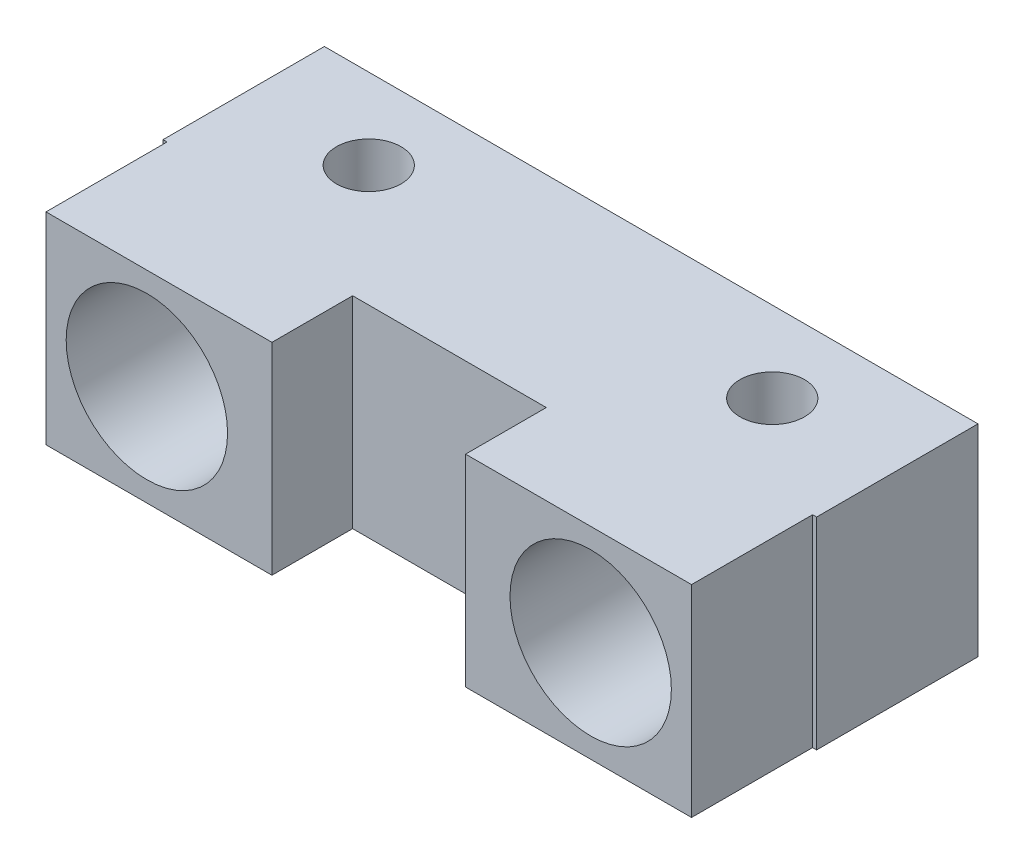
ISO-10303-21;
HEADER;
FILE_DESCRIPTION(('STEP AP214'),'2;1');
FILE_NAME('part.step','',(''),(''),'','','');
FILE_SCHEMA(('AUTOMOTIVE_DESIGN { 1 0 10303 214 1 1 1 1 }'));
ENDSEC;
DATA;
#1=APPLICATION_CONTEXT('core data for automotive mechanical design processes');
#2=APPLICATION_PROTOCOL_DEFINITION('international standard','automotive_design',2000,#1);
#3=PRODUCT_CONTEXT('',#1,'mechanical');
#4=PRODUCT('Part','Part','',(#3));
#5=PRODUCT_RELATED_PRODUCT_CATEGORY('part','',(#4));
#6=PRODUCT_DEFINITION_FORMATION('','',#4);
#7=PRODUCT_DEFINITION_CONTEXT('part definition',#1,'design');
#8=PRODUCT_DEFINITION('design','',#6,#7);
#9=PRODUCT_DEFINITION_SHAPE('','',#8);
#10=(LENGTH_UNIT() NAMED_UNIT(*) SI_UNIT(.MILLI.,.METRE.));
#11=(NAMED_UNIT(*) PLANE_ANGLE_UNIT() SI_UNIT($,.RADIAN.));
#12=(NAMED_UNIT(*) SI_UNIT($,.STERADIAN.) SOLID_ANGLE_UNIT());
#13=UNCERTAINTY_MEASURE_WITH_UNIT(LENGTH_MEASURE(1.E-05),#10,'distance_accuracy_value','');
#14=(GEOMETRIC_REPRESENTATION_CONTEXT(3) GLOBAL_UNCERTAINTY_ASSIGNED_CONTEXT((#13)) GLOBAL_UNIT_ASSIGNED_CONTEXT((#10,
#11,#12)) REPRESENTATION_CONTEXT('',''));
#15=CARTESIAN_POINT('',(0.,0.,0.));
#16=DIRECTION('',(0.,0.,1.));
#17=DIRECTION('',(1.,0.,0.));
#18=AXIS2_PLACEMENT_3D('',#15,#16,#17);
#19=CARTESIAN_POINT('',(-40.,12.5,25.));
#20=DIRECTION('',(0.,0.,-1.));
#21=DIRECTION('',(-1.,0.,0.));
#22=AXIS2_PLACEMENT_3D('',#19,#20,#21);
#23=PLANE('',#22);
#24=CARTESIAN_POINT('',(27.5,0.,25.));
#25=DIRECTION('',(0.,0.,1.));
#26=DIRECTION('',(-1.,0.,0.));
#27=AXIS2_PLACEMENT_3D('',#24,#25,#26);
#28=CIRCLE('',#27,10.);
#29=CARTESIAN_POINT('',(17.5,0.,25.));
#30=VERTEX_POINT('',#29);
#31=EDGE_CURVE('E252',#30,#30,#28,.T.);
#32=ORIENTED_EDGE('',*,*,#31,.F.);
#33=EDGE_LOOP('',(#32));
#34=FACE_BOUND('',#33,.T.);
#35=DIRECTION('',(1.,0.,0.));
#36=VECTOR('',#35,1.);
#37=CARTESIAN_POINT('',(-40.,12.5,25.));
#38=LINE('',#37,#36);
#39=CARTESIAN_POINT('',(12.,12.5,25.));
#40=VERTEX_POINT('',#39);
#41=CARTESIAN_POINT('',(40.,12.5,25.));
#42=VERTEX_POINT('',#41);
#43=EDGE_CURVE('E122',#40,#42,#38,.T.);
#44=ORIENTED_EDGE('',*,*,#43,.F.);
#45=DIRECTION('',(0.,-1.,0.));
#46=VECTOR('',#45,1.);
#47=CARTESIAN_POINT('',(12.,12.5,25.));
#48=LINE('',#47,#46);
#49=CARTESIAN_POINT('',(12.,-12.5,25.));
#50=VERTEX_POINT('',#49);
#51=EDGE_CURVE('E48',#40,#50,#48,.T.);
#52=ORIENTED_EDGE('',*,*,#51,.T.);
#53=DIRECTION('',(1.,0.,0.));
#54=VECTOR('',#53,1.);
#55=CARTESIAN_POINT('',(-40.,-12.5,25.));
#56=LINE('',#55,#54);
#57=CARTESIAN_POINT('',(40.,-12.5,25.));
#58=VERTEX_POINT('',#57);
#59=EDGE_CURVE('E142',#50,#58,#56,.T.);
#60=ORIENTED_EDGE('',*,*,#59,.T.);
#61=DIRECTION('',(0.,-1.,0.));
#62=VECTOR('',#61,1.);
#63=CARTESIAN_POINT('',(40.,12.5,25.));
#64=LINE('',#63,#62);
#65=EDGE_CURVE('E140',#42,#58,#64,.T.);
#66=ORIENTED_EDGE('',*,*,#65,.F.);
#67=EDGE_LOOP('',(#44,#52,#60,#66));
#68=FACE_BOUND('',#67,.T.);
#69=ADVANCED_FACE('F39',(#34,#68),#23,.F.);
#70=CARTESIAN_POINT('',(0.,12.5,0.));
#71=DIRECTION('',(0.,-1.,0.));
#72=DIRECTION('',(0.,0.,-1.));
#73=AXIS2_PLACEMENT_3D('',#70,#71,#72);
#74=PLANE('',#73);
#75=DIRECTION('',(1.,0.,0.));
#76=VECTOR('',#75,1.);
#77=CARTESIAN_POINT('',(0.,12.5,15.));
#78=LINE('',#77,#76);
#79=CARTESIAN_POINT('',(-12.,12.5,15.));
#80=VERTEX_POINT('',#79);
#81=CARTESIAN_POINT('',(12.,12.5,15.));
#82=VERTEX_POINT('',#81);
#83=EDGE_CURVE('E256',#80,#82,#78,.T.);
#84=ORIENTED_EDGE('',*,*,#83,.T.);
#85=DIRECTION('',(0.,0.,1.));
#86=VECTOR('',#85,1.);
#87=CARTESIAN_POINT('',(12.,12.5,0.));
#88=LINE('',#87,#86);
#89=EDGE_CURVE('E132',#82,#40,#88,.T.);
#90=ORIENTED_EDGE('',*,*,#89,.T.);
#91=ORIENTED_EDGE('',*,*,#43,.T.);
#92=DIRECTION('',(0.,0.,-1.));
#93=VECTOR('',#92,1.);
#94=CARTESIAN_POINT('',(40.,12.5,9.99999999999999));
#95=LINE('',#94,#93);
#96=CARTESIAN_POINT('',(40.,12.5,9.99999999999999));
#97=VERTEX_POINT('',#96);
#98=EDGE_CURVE('E128',#42,#97,#95,.T.);
#99=ORIENTED_EDGE('',*,*,#98,.T.);
#100=DIRECTION('',(1.,0.,0.));
#101=VECTOR('',#100,1.);
#102=CARTESIAN_POINT('',(40.,12.5,9.99999999999999));
#103=LINE('',#102,#101);
#104=CARTESIAN_POINT('',(40.5,12.5,10.));
#105=VERTEX_POINT('',#104);
#106=EDGE_CURVE('E64',#97,#105,#103,.T.);
#107=ORIENTED_EDGE('',*,*,#106,.T.);
#108=DIRECTION('',(0.,0.,-1.));
#109=VECTOR('',#108,1.);
#110=CARTESIAN_POINT('',(40.5,12.5,10.));
#111=LINE('',#110,#109);
#112=CARTESIAN_POINT('',(40.5,12.5,-10.));
#113=VERTEX_POINT('',#112);
#114=EDGE_CURVE('E185',#105,#113,#111,.T.);
#115=ORIENTED_EDGE('',*,*,#114,.T.);
#116=DIRECTION('',(-1.,0.,0.));
#117=VECTOR('',#116,1.);
#118=CARTESIAN_POINT('',(-40.5,12.5,-10.));
#119=LINE('',#118,#117);
#120=CARTESIAN_POINT('',(-40.5,12.5,-10.));
#121=VERTEX_POINT('',#120);
#122=EDGE_CURVE('E106',#113,#121,#119,.T.);
#123=ORIENTED_EDGE('',*,*,#122,.T.);
#124=DIRECTION('',(0.,0.,1.));
#125=VECTOR('',#124,1.);
#126=CARTESIAN_POINT('',(-40.5,12.5,10.));
#127=LINE('',#126,#125);
#128=CARTESIAN_POINT('',(-40.5,12.5,10.));
#129=VERTEX_POINT('',#128);
#130=EDGE_CURVE('E285',#121,#129,#127,.T.);
#131=ORIENTED_EDGE('',*,*,#130,.T.);
#132=DIRECTION('',(1.,0.,0.));
#133=VECTOR('',#132,1.);
#134=CARTESIAN_POINT('',(-40.5,12.5,10.));
#135=LINE('',#134,#133);
#136=CARTESIAN_POINT('',(-40.,12.5,10.));
#137=VERTEX_POINT('',#136);
#138=EDGE_CURVE('E288',#129,#137,#135,.T.);
#139=ORIENTED_EDGE('',*,*,#138,.T.);
#140=DIRECTION('',(0.,0.,1.));
#141=VECTOR('',#140,1.);
#142=CARTESIAN_POINT('',(-40.,12.5,10.));
#143=LINE('',#142,#141);
#144=CARTESIAN_POINT('',(-40.,12.5,25.));
#145=VERTEX_POINT('',#144);
#146=EDGE_CURVE('E137',#137,#145,#143,.T.);
#147=ORIENTED_EDGE('',*,*,#146,.T.);
#148=CARTESIAN_POINT('',(-12.,12.5,25.));
#149=VERTEX_POINT('',#148);
#150=EDGE_CURVE('E136',#145,#149,#38,.T.);
#151=ORIENTED_EDGE('',*,*,#150,.T.);
#152=DIRECTION('',(0.,0.,-1.));
#153=VECTOR('',#152,1.);
#154=CARTESIAN_POINT('',(-12.,12.5,0.));
#155=LINE('',#154,#153);
#156=EDGE_CURVE('E55',#149,#80,#155,.T.);
#157=ORIENTED_EDGE('',*,*,#156,.T.);
#158=EDGE_LOOP('',(#84,#90,#91,#99,#107,#115,#123,#131,#139,#147,#151,#157));
#159=FACE_BOUND('',#158,.T.);
#160=CARTESIAN_POINT('',(-25.,12.5,0.));
#161=DIRECTION('',(0.,1.,0.));
#162=DIRECTION('',(0.,0.,1.));
#163=AXIS2_PLACEMENT_3D('',#160,#161,#162);
#164=CIRCLE('',#163,4.);
#165=CARTESIAN_POINT('',(-25.,12.5,4.));
#166=VERTEX_POINT('',#165);
#167=EDGE_CURVE('E164',#166,#166,#164,.T.);
#168=ORIENTED_EDGE('',*,*,#167,.F.);
#169=EDGE_LOOP('',(#168));
#170=FACE_BOUND('',#169,.T.);
#171=CARTESIAN_POINT('',(25.,12.5,0.));
#172=DIRECTION('',(0.,1.,0.));
#173=DIRECTION('',(0.,0.,-1.));
#174=AXIS2_PLACEMENT_3D('',#171,#172,#173);
#175=CIRCLE('',#174,4.);
#176=CARTESIAN_POINT('',(25.,12.5,-4.00000000000001));
#177=VERTEX_POINT('',#176);
#178=EDGE_CURVE('E232',#177,#177,#175,.T.);
#179=ORIENTED_EDGE('',*,*,#178,.F.);
#180=EDGE_LOOP('',(#179));
#181=FACE_BOUND('',#180,.T.);
#182=ADVANCED_FACE('F125',(#159,#170,#181),#74,.F.);
#183=CARTESIAN_POINT('',(0.,-12.5,0.));
#184=DIRECTION('',(0.,-1.,0.));
#185=DIRECTION('',(0.,0.,-1.));
#186=AXIS2_PLACEMENT_3D('',#183,#184,#185);
#187=PLANE('',#186);
#188=DIRECTION('',(0.,0.,1.));
#189=VECTOR('',#188,1.);
#190=CARTESIAN_POINT('',(12.,-12.5,0.));
#191=LINE('',#190,#189);
#192=CARTESIAN_POINT('',(12.,-12.5,15.));
#193=VERTEX_POINT('',#192);
#194=EDGE_CURVE('E223',#193,#50,#191,.T.);
#195=ORIENTED_EDGE('',*,*,#194,.F.);
#196=DIRECTION('',(1.,0.,0.));
#197=VECTOR('',#196,1.);
#198=CARTESIAN_POINT('',(0.,-12.5,15.));
#199=LINE('',#198,#197);
#200=CARTESIAN_POINT('',(-12.,-12.5,15.));
#201=VERTEX_POINT('',#200);
#202=EDGE_CURVE('E11',#201,#193,#199,.T.);
#203=ORIENTED_EDGE('',*,*,#202,.F.);
#204=DIRECTION('',(0.,0.,-1.));
#205=VECTOR('',#204,1.);
#206=CARTESIAN_POINT('',(-12.,-12.5,0.));
#207=LINE('',#206,#205);
#208=CARTESIAN_POINT('',(-12.,-12.5,25.));
#209=VERTEX_POINT('',#208);
#210=EDGE_CURVE('E265',#209,#201,#207,.T.);
#211=ORIENTED_EDGE('',*,*,#210,.F.);
#212=CARTESIAN_POINT('',(-40.,-12.5,25.));
#213=VERTEX_POINT('',#212);
#214=EDGE_CURVE('E176',#213,#209,#56,.T.);
#215=ORIENTED_EDGE('',*,*,#214,.F.);
#216=DIRECTION('',(0.,0.,1.));
#217=VECTOR('',#216,1.);
#218=CARTESIAN_POINT('',(-40.,-12.5,10.));
#219=LINE('',#218,#217);
#220=CARTESIAN_POINT('',(-40.,-12.5,10.));
#221=VERTEX_POINT('',#220);
#222=EDGE_CURVE('E173',#221,#213,#219,.T.);
#223=ORIENTED_EDGE('',*,*,#222,.F.);
#224=DIRECTION('',(1.,0.,0.));
#225=VECTOR('',#224,1.);
#226=CARTESIAN_POINT('',(-40.5,-12.5,10.));
#227=LINE('',#226,#225);
#228=CARTESIAN_POINT('',(-40.5,-12.5,10.));
#229=VERTEX_POINT('',#228);
#230=EDGE_CURVE('E170',#229,#221,#227,.T.);
#231=ORIENTED_EDGE('',*,*,#230,.F.);
#232=DIRECTION('',(0.,0.,1.));
#233=VECTOR('',#232,1.);
#234=CARTESIAN_POINT('',(-40.5,-12.5,10.));
#235=LINE('',#234,#233);
#236=CARTESIAN_POINT('',(-40.5,-12.5,-10.));
#237=VERTEX_POINT('',#236);
#238=EDGE_CURVE('E167',#237,#229,#235,.T.);
#239=ORIENTED_EDGE('',*,*,#238,.F.);
#240=DIRECTION('',(-1.,0.,0.));
#241=VECTOR('',#240,1.);
#242=CARTESIAN_POINT('',(-40.5,-12.5,-10.));
#243=LINE('',#242,#241);
#244=CARTESIAN_POINT('',(40.5,-12.5,-10.));
#245=VERTEX_POINT('',#244);
#246=EDGE_CURVE('E163',#245,#237,#243,.T.);
#247=ORIENTED_EDGE('',*,*,#246,.F.);
#248=DIRECTION('',(0.,0.,-1.));
#249=VECTOR('',#248,1.);
#250=CARTESIAN_POINT('',(40.5,-12.5,10.));
#251=LINE('',#250,#249);
#252=CARTESIAN_POINT('',(40.5,-12.5,10.));
#253=VERTEX_POINT('',#252);
#254=EDGE_CURVE('E159',#253,#245,#251,.T.);
#255=ORIENTED_EDGE('',*,*,#254,.F.);
#256=DIRECTION('',(1.,0.,0.));
#257=VECTOR('',#256,1.);
#258=CARTESIAN_POINT('',(40.,-12.5,9.99999999999999));
#259=LINE('',#258,#257);
#260=CARTESIAN_POINT('',(40.,-12.5,9.99999999999999));
#261=VERTEX_POINT('',#260);
#262=EDGE_CURVE('E97',#261,#253,#259,.T.);
#263=ORIENTED_EDGE('',*,*,#262,.F.);
#264=DIRECTION('',(0.,0.,-1.));
#265=VECTOR('',#264,1.);
#266=CARTESIAN_POINT('',(40.,-12.5,9.99999999999999));
#267=LINE('',#266,#265);
#268=EDGE_CURVE('E180',#58,#261,#267,.T.);
#269=ORIENTED_EDGE('',*,*,#268,.F.);
#270=ORIENTED_EDGE('',*,*,#59,.F.);
#271=EDGE_LOOP('',(#195,#203,#211,#215,#223,#231,#239,#247,#255,#263,#269,#270));
#272=FACE_BOUND('',#271,.T.);
#273=CARTESIAN_POINT('',(-25.,-12.5,0.));
#274=DIRECTION('',(0.,1.,0.));
#275=DIRECTION('',(0.,0.,1.));
#276=AXIS2_PLACEMENT_3D('',#273,#274,#275);
#277=CIRCLE('',#276,4.);
#278=CARTESIAN_POINT('',(-25.,-12.5,4.));
#279=VERTEX_POINT('',#278);
#280=EDGE_CURVE('E228',#279,#279,#277,.T.);
#281=ORIENTED_EDGE('',*,*,#280,.T.);
#282=EDGE_LOOP('',(#281));
#283=FACE_BOUND('',#282,.T.);
#284=CARTESIAN_POINT('',(25.,-12.5,0.));
#285=DIRECTION('',(0.,1.,0.));
#286=DIRECTION('',(0.,0.,-1.));
#287=AXIS2_PLACEMENT_3D('',#284,#285,#286);
#288=CIRCLE('',#287,4.);
#289=CARTESIAN_POINT('',(25.,-12.5,-4.00000000000001));
#290=VERTEX_POINT('',#289);
#291=EDGE_CURVE('E236',#290,#290,#288,.T.);
#292=ORIENTED_EDGE('',*,*,#291,.T.);
#293=EDGE_LOOP('',(#292));
#294=FACE_BOUND('',#293,.T.);
#295=ADVANCED_FACE('F219',(#272,#283,#294),#187,.T.);
#296=CARTESIAN_POINT('',(40.5,12.5,10.));
#297=DIRECTION('',(-1.,0.,0.));
#298=DIRECTION('',(0.,0.,1.));
#299=AXIS2_PLACEMENT_3D('',#296,#297,#298);
#300=PLANE('',#299);
#301=ORIENTED_EDGE('',*,*,#254,.T.);
#302=DIRECTION('',(0.,-1.,0.));
#303=VECTOR('',#302,1.);
#304=CARTESIAN_POINT('',(40.5,12.5,-10.));
#305=LINE('',#304,#303);
#306=EDGE_CURVE('E205',#113,#245,#305,.T.);
#307=ORIENTED_EDGE('',*,*,#306,.F.);
#308=ORIENTED_EDGE('',*,*,#114,.F.);
#309=DIRECTION('',(0.,-1.,0.));
#310=VECTOR('',#309,1.);
#311=CARTESIAN_POINT('',(40.5,12.5,10.));
#312=LINE('',#311,#310);
#313=EDGE_CURVE('E154',#105,#253,#312,.T.);
#314=ORIENTED_EDGE('',*,*,#313,.T.);
#315=EDGE_LOOP('',(#301,#307,#308,#314));
#316=FACE_BOUND('',#315,.T.);
#317=ADVANCED_FACE('F41',(#316),#300,.F.);
#318=CARTESIAN_POINT('',(-40.5,12.5,-10.));
#319=DIRECTION('',(0.,0.,1.));
#320=DIRECTION('',(1.,0.,0.));
#321=AXIS2_PLACEMENT_3D('',#318,#319,#320);
#322=PLANE('',#321);
#323=ORIENTED_EDGE('',*,*,#246,.T.);
#324=DIRECTION('',(0.,-1.,0.));
#325=VECTOR('',#324,1.);
#326=CARTESIAN_POINT('',(-40.5,12.5,-10.));
#327=LINE('',#326,#325);
#328=EDGE_CURVE('E201',#121,#237,#327,.T.);
#329=ORIENTED_EDGE('',*,*,#328,.F.);
#330=ORIENTED_EDGE('',*,*,#122,.F.);
#331=ORIENTED_EDGE('',*,*,#306,.T.);
#332=EDGE_LOOP('',(#323,#329,#330,#331));
#333=FACE_BOUND('',#332,.T.);
#334=ADVANCED_FACE('F474',(#333),#322,.F.);
#335=CARTESIAN_POINT('',(-40.5,12.5,10.));
#336=DIRECTION('',(1.,0.,0.));
#337=DIRECTION('',(0.,0.,-1.));
#338=AXIS2_PLACEMENT_3D('',#335,#336,#337);
#339=PLANE('',#338);
#340=ORIENTED_EDGE('',*,*,#238,.T.);
#341=DIRECTION('',(0.,-1.,0.));
#342=VECTOR('',#341,1.);
#343=CARTESIAN_POINT('',(-40.5,12.5,10.));
#344=LINE('',#343,#342);
#345=EDGE_CURVE('E197',#129,#229,#344,.T.);
#346=ORIENTED_EDGE('',*,*,#345,.F.);
#347=ORIENTED_EDGE('',*,*,#130,.F.);
#348=ORIENTED_EDGE('',*,*,#328,.T.);
#349=EDGE_LOOP('',(#340,#346,#347,#348));
#350=FACE_BOUND('',#349,.T.);
#351=ADVANCED_FACE('F464',(#350),#339,.F.);
#352=CARTESIAN_POINT('',(-40.5,12.5,10.));
#353=DIRECTION('',(0.,0.,-1.));
#354=DIRECTION('',(-1.,0.,0.));
#355=AXIS2_PLACEMENT_3D('',#352,#353,#354);
#356=PLANE('',#355);
#357=ORIENTED_EDGE('',*,*,#230,.T.);
#358=DIRECTION('',(0.,-1.,0.));
#359=VECTOR('',#358,1.);
#360=CARTESIAN_POINT('',(-40.,12.5,10.));
#361=LINE('',#360,#359);
#362=EDGE_CURVE('E193',#137,#221,#361,.T.);
#363=ORIENTED_EDGE('',*,*,#362,.F.);
#364=ORIENTED_EDGE('',*,*,#138,.F.);
#365=ORIENTED_EDGE('',*,*,#345,.T.);
#366=EDGE_LOOP('',(#357,#363,#364,#365));
#367=FACE_BOUND('',#366,.T.);
#368=ADVANCED_FACE('F337',(#367),#356,.F.);
#369=CARTESIAN_POINT('',(-40.,12.5,10.));
#370=DIRECTION('',(1.,0.,0.));
#371=DIRECTION('',(0.,0.,-1.));
#372=AXIS2_PLACEMENT_3D('',#369,#370,#371);
#373=PLANE('',#372);
#374=ORIENTED_EDGE('',*,*,#222,.T.);
#375=DIRECTION('',(0.,-1.,0.));
#376=VECTOR('',#375,1.);
#377=CARTESIAN_POINT('',(-40.,12.5,25.));
#378=LINE('',#377,#376);
#379=EDGE_CURVE('E146',#145,#213,#378,.T.);
#380=ORIENTED_EDGE('',*,*,#379,.F.);
#381=ORIENTED_EDGE('',*,*,#146,.F.);
#382=ORIENTED_EDGE('',*,*,#362,.T.);
#383=EDGE_LOOP('',(#374,#380,#381,#382));
#384=FACE_BOUND('',#383,.T.);
#385=ADVANCED_FACE('F297',(#384),#373,.F.);
#386=CARTESIAN_POINT('',(-27.5,0.,25.));
#387=DIRECTION('',(0.,0.,1.));
#388=DIRECTION('',(1.,0.,0.));
#389=AXIS2_PLACEMENT_3D('',#386,#387,#388);
#390=CIRCLE('',#389,10.);
#391=CARTESIAN_POINT('',(-17.5,0.,25.));
#392=VERTEX_POINT('',#391);
#393=EDGE_CURVE('E244',#392,#392,#390,.T.);
#394=ORIENTED_EDGE('',*,*,#393,.F.);
#395=EDGE_LOOP('',(#394));
#396=FACE_BOUND('',#395,.T.);
#397=ORIENTED_EDGE('',*,*,#214,.T.);
#398=DIRECTION('',(0.,1.,0.));
#399=VECTOR('',#398,1.);
#400=CARTESIAN_POINT('',(-12.,12.5,25.));
#401=LINE('',#400,#399);
#402=EDGE_CURVE('E208',#209,#149,#401,.T.);
#403=ORIENTED_EDGE('',*,*,#402,.T.);
#404=ORIENTED_EDGE('',*,*,#150,.F.);
#405=ORIENTED_EDGE('',*,*,#379,.T.);
#406=EDGE_LOOP('',(#397,#403,#404,#405));
#407=FACE_BOUND('',#406,.T.);
#408=ADVANCED_FACE('F301',(#396,#407),#23,.F.);
#409=CARTESIAN_POINT('',(40.,12.5,9.99999999999999));
#410=DIRECTION('',(-1.,0.,0.));
#411=DIRECTION('',(0.,0.,1.));
#412=AXIS2_PLACEMENT_3D('',#409,#410,#411);
#413=PLANE('',#412);
#414=ORIENTED_EDGE('',*,*,#268,.T.);
#415=DIRECTION('',(0.,-1.,0.));
#416=VECTOR('',#415,1.);
#417=CARTESIAN_POINT('',(40.,12.5,9.99999999999999));
#418=LINE('',#417,#416);
#419=EDGE_CURVE('E147',#97,#261,#418,.T.);
#420=ORIENTED_EDGE('',*,*,#419,.F.);
#421=ORIENTED_EDGE('',*,*,#98,.F.);
#422=ORIENTED_EDGE('',*,*,#65,.T.);
#423=EDGE_LOOP('',(#414,#420,#421,#422));
#424=FACE_BOUND('',#423,.T.);
#425=ADVANCED_FACE('F149',(#424),#413,.F.);
#426=CARTESIAN_POINT('',(40.,12.5,9.99999999999999));
#427=DIRECTION('',(0.,0.,-1.));
#428=DIRECTION('',(-1.,0.,0.));
#429=AXIS2_PLACEMENT_3D('',#426,#427,#428);
#430=PLANE('',#429);
#431=ORIENTED_EDGE('',*,*,#262,.T.);
#432=ORIENTED_EDGE('',*,*,#313,.F.);
#433=ORIENTED_EDGE('',*,*,#106,.F.);
#434=ORIENTED_EDGE('',*,*,#419,.T.);
#435=EDGE_LOOP('',(#431,#432,#433,#434));
#436=FACE_BOUND('',#435,.T.);
#437=ADVANCED_FACE('F336',(#436),#430,.F.);
#438=CARTESIAN_POINT('',(-25.,12.5,0.));
#439=DIRECTION('',(0.,-1.,0.));
#440=DIRECTION('',(0.,0.,-1.));
#441=AXIS2_PLACEMENT_3D('',#438,#439,#440);
#442=CYLINDRICAL_SURFACE('',#441,4.);
#443=ORIENTED_EDGE('',*,*,#167,.T.);
#444=EDGE_LOOP('',(#443));
#445=FACE_BOUND('',#444,.T.);
#446=ORIENTED_EDGE('',*,*,#280,.F.);
#447=EDGE_LOOP('',(#446));
#448=FACE_BOUND('',#447,.T.);
#449=ADVANCED_FACE('F361',(#445,#448),#442,.F.);
#450=CARTESIAN_POINT('',(25.,12.5,0.));
#451=DIRECTION('',(0.,-1.,0.));
#452=DIRECTION('',(0.,0.,-1.));
#453=AXIS2_PLACEMENT_3D('',#450,#451,#452);
#454=CYLINDRICAL_SURFACE('',#453,4.);
#455=ORIENTED_EDGE('',*,*,#178,.T.);
#456=EDGE_LOOP('',(#455));
#457=FACE_BOUND('',#456,.T.);
#458=ORIENTED_EDGE('',*,*,#291,.F.);
#459=EDGE_LOOP('',(#458));
#460=FACE_BOUND('',#459,.T.);
#461=ADVANCED_FACE('F357',(#457,#460),#454,.F.);
#462=CARTESIAN_POINT('',(27.5,0.,10.));
#463=DIRECTION('',(0.,0.,1.));
#464=DIRECTION('',(1.,0.,0.));
#465=AXIS2_PLACEMENT_3D('',#462,#463,#464);
#466=CYLINDRICAL_SURFACE('',#465,10.);
#467=CARTESIAN_POINT('',(27.5,0.,10.));
#468=DIRECTION('',(0.,0.,1.));
#469=DIRECTION('',(-1.,0.,0.));
#470=AXIS2_PLACEMENT_3D('',#467,#468,#469);
#471=CIRCLE('',#470,10.);
#472=CARTESIAN_POINT('',(17.5,0.,10.));
#473=VERTEX_POINT('',#472);
#474=EDGE_CURVE('E248',#473,#473,#471,.T.);
#475=ORIENTED_EDGE('',*,*,#474,.F.);
#476=EDGE_LOOP('',(#475));
#477=FACE_BOUND('',#476,.T.);
#478=ORIENTED_EDGE('',*,*,#31,.T.);
#479=EDGE_LOOP('',(#478));
#480=FACE_BOUND('',#479,.T.);
#481=ADVANCED_FACE('F350',(#477,#480),#466,.F.);
#482=CARTESIAN_POINT('',(27.5,0.,10.));
#483=DIRECTION('',(0.,0.,-1.));
#484=DIRECTION('',(-1.,0.,0.));
#485=AXIS2_PLACEMENT_3D('',#482,#483,#484);
#486=PLANE('',#485);
#487=ORIENTED_EDGE('',*,*,#474,.T.);
#488=EDGE_LOOP('',(#487));
#489=FACE_BOUND('',#488,.T.);
#490=ADVANCED_FACE('F342',(#489),#486,.F.);
#491=CARTESIAN_POINT('',(-27.5,0.,10.));
#492=DIRECTION('',(0.,0.,1.));
#493=DIRECTION('',(1.,0.,0.));
#494=AXIS2_PLACEMENT_3D('',#491,#492,#493);
#495=CYLINDRICAL_SURFACE('',#494,10.);
#496=CARTESIAN_POINT('',(-27.5,0.,10.));
#497=DIRECTION('',(0.,0.,1.));
#498=DIRECTION('',(1.,0.,0.));
#499=AXIS2_PLACEMENT_3D('',#496,#497,#498);
#500=CIRCLE('',#499,10.);
#501=CARTESIAN_POINT('',(-17.5,0.,10.));
#502=VERTEX_POINT('',#501);
#503=EDGE_CURVE('E240',#502,#502,#500,.T.);
#504=ORIENTED_EDGE('',*,*,#503,.F.);
#505=EDGE_LOOP('',(#504));
#506=FACE_BOUND('',#505,.T.);
#507=ORIENTED_EDGE('',*,*,#393,.T.);
#508=EDGE_LOOP('',(#507));
#509=FACE_BOUND('',#508,.T.);
#510=ADVANCED_FACE('F340',(#506,#509),#495,.F.);
#511=CARTESIAN_POINT('',(-27.5,0.,10.));
#512=DIRECTION('',(0.,0.,1.));
#513=DIRECTION('',(1.,0.,0.));
#514=AXIS2_PLACEMENT_3D('',#511,#512,#513);
#515=PLANE('',#514);
#516=ORIENTED_EDGE('',*,*,#503,.T.);
#517=EDGE_LOOP('',(#516));
#518=FACE_BOUND('',#517,.T.);
#519=ADVANCED_FACE('F317',(#518),#515,.T.);
#520=CARTESIAN_POINT('',(0.,0.,15.));
#521=DIRECTION('',(0.,0.,-1.));
#522=DIRECTION('',(-1.,0.,0.));
#523=AXIS2_PLACEMENT_3D('',#520,#521,#522);
#524=PLANE('',#523);
#525=DIRECTION('',(0.,-1.,0.));
#526=VECTOR('',#525,1.);
#527=CARTESIAN_POINT('',(-12.,-15.5,15.));
#528=LINE('',#527,#526);
#529=EDGE_CURVE('E269',#80,#201,#528,.T.);
#530=ORIENTED_EDGE('',*,*,#529,.T.);
#531=ORIENTED_EDGE('',*,*,#202,.T.);
#532=DIRECTION('',(0.,1.,0.));
#533=VECTOR('',#532,1.);
#534=CARTESIAN_POINT('',(12.,-15.5,15.));
#535=LINE('',#534,#533);
#536=EDGE_CURVE('E273',#193,#82,#535,.T.);
#537=ORIENTED_EDGE('',*,*,#536,.T.);
#538=ORIENTED_EDGE('',*,*,#83,.F.);
#539=EDGE_LOOP('',(#530,#531,#537,#538));
#540=FACE_BOUND('',#539,.T.);
#541=ADVANCED_FACE('F308',(#540),#524,.F.);
#542=CARTESIAN_POINT('',(12.,-15.5,15.));
#543=DIRECTION('',(1.,0.,0.));
#544=DIRECTION('',(0.,0.,-1.));
#545=AXIS2_PLACEMENT_3D('',#542,#543,#544);
#546=PLANE('',#545);
#547=ORIENTED_EDGE('',*,*,#536,.F.);
#548=ORIENTED_EDGE('',*,*,#194,.T.);
#549=ORIENTED_EDGE('',*,*,#51,.F.);
#550=ORIENTED_EDGE('',*,*,#89,.F.);
#551=EDGE_LOOP('',(#547,#548,#549,#550));
#552=FACE_BOUND('',#551,.T.);
#553=ADVANCED_FACE('F309',(#552),#546,.F.);
#554=CARTESIAN_POINT('',(-12.,-15.5,15.));
#555=DIRECTION('',(-1.,0.,0.));
#556=DIRECTION('',(0.,0.,1.));
#557=AXIS2_PLACEMENT_3D('',#554,#555,#556);
#558=PLANE('',#557);
#559=ORIENTED_EDGE('',*,*,#402,.F.);
#560=ORIENTED_EDGE('',*,*,#210,.T.);
#561=ORIENTED_EDGE('',*,*,#529,.F.);
#562=ORIENTED_EDGE('',*,*,#156,.F.);
#563=EDGE_LOOP('',(#559,#560,#561,#562));
#564=FACE_BOUND('',#563,.T.);
#565=ADVANCED_FACE('F304',(#564),#558,.F.);
#566=CLOSED_SHELL('',(#69,#182,#295,#317,#334,#351,#368,#385,#408,#425,#437,#449,#461,#481,#490,
#510,#519,#541,#553,#565));
#567=MANIFOLD_SOLID_BREP('B2',#566);
#568=ADVANCED_BREP_SHAPE_REPRESENTATION('',(#18,#567),#14);
#569=SHAPE_DEFINITION_REPRESENTATION(#9,#568);
ENDSEC;
END-ISO-10303-21;
